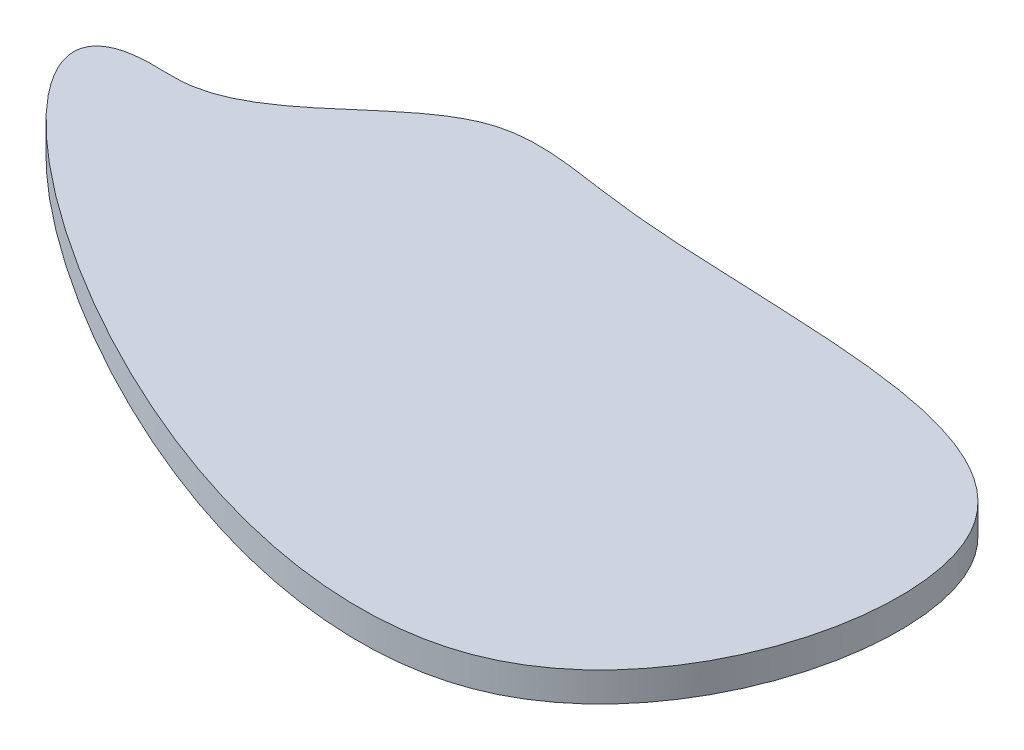
ISO-10303-21;
HEADER;
FILE_DESCRIPTION(('STEP AP214'),'2;1');
FILE_NAME('part.step','',(''),(''),'','','');
FILE_SCHEMA(('AUTOMOTIVE_DESIGN { 1 0 10303 214 1 1 1 1 }'));
ENDSEC;
DATA;
#1=APPLICATION_CONTEXT('core data for automotive mechanical design processes');
#2=APPLICATION_PROTOCOL_DEFINITION('international standard','automotive_design',2000,#1);
#3=PRODUCT_CONTEXT('',#1,'mechanical');
#4=PRODUCT('Part','Part','',(#3));
#5=PRODUCT_RELATED_PRODUCT_CATEGORY('part','',(#4));
#6=PRODUCT_DEFINITION_FORMATION('','',#4);
#7=PRODUCT_DEFINITION_CONTEXT('part definition',#1,'design');
#8=PRODUCT_DEFINITION('design','',#6,#7);
#9=PRODUCT_DEFINITION_SHAPE('','',#8);
#10=(LENGTH_UNIT() NAMED_UNIT(*) SI_UNIT(.MILLI.,.METRE.));
#11=(NAMED_UNIT(*) PLANE_ANGLE_UNIT() SI_UNIT($,.RADIAN.));
#12=(NAMED_UNIT(*) SI_UNIT($,.STERADIAN.) SOLID_ANGLE_UNIT());
#13=UNCERTAINTY_MEASURE_WITH_UNIT(LENGTH_MEASURE(1.E-05),#10,'distance_accuracy_value','');
#14=(GEOMETRIC_REPRESENTATION_CONTEXT(3) GLOBAL_UNCERTAINTY_ASSIGNED_CONTEXT((#13)) GLOBAL_UNIT_ASSIGNED_CONTEXT((#10,
#11,#12)) REPRESENTATION_CONTEXT('',''));
#15=CARTESIAN_POINT('',(0.,0.,0.));
#16=DIRECTION('',(0.,0.,1.));
#17=DIRECTION('',(1.,0.,0.));
#18=AXIS2_PLACEMENT_3D('',#15,#16,#17);
#19=CARTESIAN_POINT('',(0.,10.,0.));
#20=CARTESIAN_POINT('',(-3.16972989677205,10.,0.218598073851008));
#21=CARTESIAN_POINT('',(-96.8908436644234,10.,-5.840597093625));
#22=CARTESIAN_POINT('',(229.974546665391,10.,233.770498352265));
#23=CARTESIAN_POINT('',(306.264533079061,10.,-51.6264392201288));
#24=CARTESIAN_POINT('',(147.7890464411,10.,-28.0157943688024));
#25=CARTESIAN_POINT('',(52.4626417395682,10.,-49.680046201907));
#26=CARTESIAN_POINT('',(26.0451786235807,10.,-1.79618644668055));
#27=CARTESIAN_POINT('',(0.,10.,0.));
#28=B_SPLINE_CURVE_WITH_KNOTS('',3,(#19,#20,#21,#22,#23,#24,#25,#26,#27),.UNSPECIFIED.,.T.,.F.,
(4,1,1,1,1,1,4),(0.,0.0138626814465455,0.393416154145901,0.582625666537913,0.823885426134454,
0.886092498024908,1.),.UNSPECIFIED.);
#29=DIRECTION('',(0.,-1.,0.));
#30=VECTOR('',#29,1.);
#31=SURFACE_OF_LINEAR_EXTRUSION('',#28,#30);
#32=CARTESIAN_POINT('',(0.,10.,0.));
#33=VERTEX_POINT('',#32);
#34=EDGE_CURVE('E10',#33,#33,#28,.T.);
#35=ORIENTED_EDGE('',*,*,#34,.F.);
#36=EDGE_LOOP('',(#35));
#37=FACE_BOUND('',#36,.T.);
#38=CARTESIAN_POINT('',(0.,0.,0.));
#39=CARTESIAN_POINT('',(-3.16972989677205,0.,0.218598073851008));
#40=CARTESIAN_POINT('',(-96.8908436644234,0.,-5.840597093625));
#41=CARTESIAN_POINT('',(229.974546665391,0.,233.770498352265));
#42=CARTESIAN_POINT('',(306.264533079061,0.,-51.6264392201288));
#43=CARTESIAN_POINT('',(147.7890464411,0.,-28.0157943688024));
#44=CARTESIAN_POINT('',(52.4626417395682,0.,-49.680046201907));
#45=CARTESIAN_POINT('',(26.0451786235807,0.,-1.79618644668055));
#46=CARTESIAN_POINT('',(0.,0.,0.));
#47=B_SPLINE_CURVE_WITH_KNOTS('',3,(#38,#39,#40,#41,#42,#43,#44,#45,#46),.UNSPECIFIED.,.T.,.F.,
(4,1,1,1,1,1,4),(0.,0.0138626814465455,0.393416154145901,0.582625666537913,0.823885426134454,
0.886092498024908,1.),.UNSPECIFIED.);
#48=CARTESIAN_POINT('',(0.,0.,0.));
#49=VERTEX_POINT('',#48);
#50=EDGE_CURVE('E35',#49,#49,#47,.T.);
#51=ORIENTED_EDGE('',*,*,#50,.T.);
#52=EDGE_LOOP('',(#51));
#53=FACE_BOUND('',#52,.T.);
#54=ADVANCED_FACE('F31',(#37,#53),#31,.F.);
#55=CARTESIAN_POINT('',(269.38772884149,10.,55.9951432862831));
#56=DIRECTION('',(0.,-1.,0.));
#57=DIRECTION('',(0.,0.,-1.));
#58=AXIS2_PLACEMENT_3D('',#55,#56,#57);
#59=PLANE('',#58);
#60=ORIENTED_EDGE('',*,*,#34,.T.);
#61=EDGE_LOOP('',(#60));
#62=FACE_BOUND('',#61,.T.);
#63=ADVANCED_FACE('F54',(#62),#59,.F.);
#64=CARTESIAN_POINT('',(269.38772884149,0.,55.9951432862831));
#65=DIRECTION('',(0.,-1.,0.));
#66=DIRECTION('',(0.,0.,-1.));
#67=AXIS2_PLACEMENT_3D('',#64,#65,#66);
#68=PLANE('',#67);
#69=ORIENTED_EDGE('',*,*,#50,.F.);
#70=EDGE_LOOP('',(#69));
#71=FACE_BOUND('',#70,.T.);
#72=ADVANCED_FACE('F52',(#71),#68,.T.);
#73=CLOSED_SHELL('',(#54,#63,#72));
#74=MANIFOLD_SOLID_BREP('B2',#73);
#75=ADVANCED_BREP_SHAPE_REPRESENTATION('',(#18,#74),#14);
#76=SHAPE_DEFINITION_REPRESENTATION(#9,#75);
ENDSEC;
END-ISO-10303-21;
